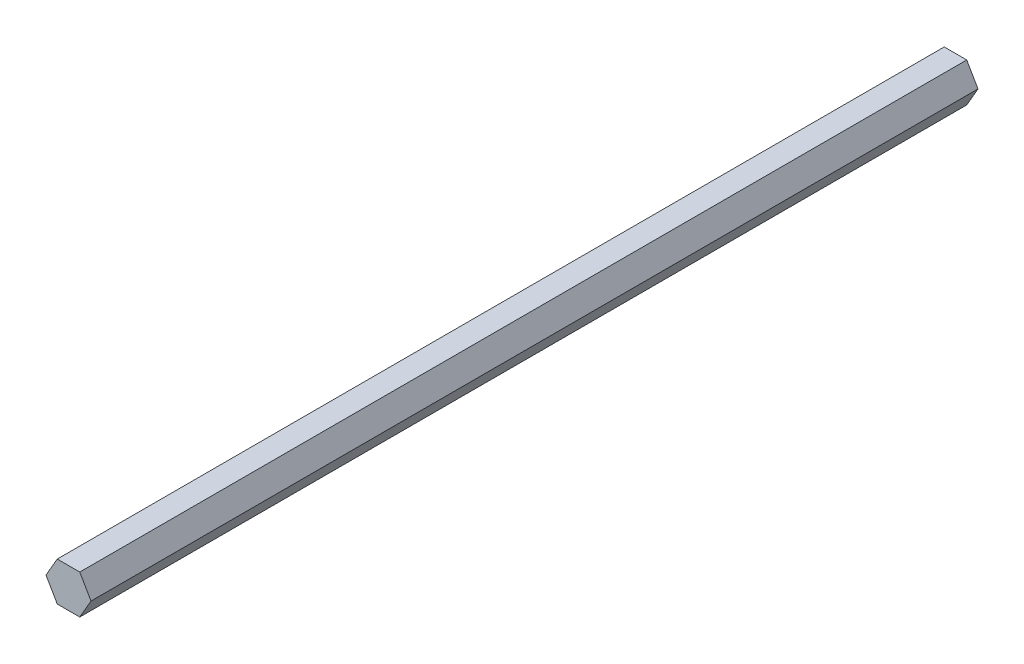
ISO-10303-21;
HEADER;
FILE_DESCRIPTION(('STEP AP214'),'2;1');
FILE_NAME('part.step','',(''),(''),'','','');
FILE_SCHEMA(('AUTOMOTIVE_DESIGN { 1 0 10303 214 1 1 1 1 }'));
ENDSEC;
DATA;
#1=APPLICATION_CONTEXT('core data for automotive mechanical design processes');
#2=APPLICATION_PROTOCOL_DEFINITION('international standard','automotive_design',2000,#1);
#3=PRODUCT_CONTEXT('',#1,'mechanical');
#4=PRODUCT('Part','Part','',(#3));
#5=PRODUCT_RELATED_PRODUCT_CATEGORY('part','',(#4));
#6=PRODUCT_DEFINITION_FORMATION('','',#4);
#7=PRODUCT_DEFINITION_CONTEXT('part definition',#1,'design');
#8=PRODUCT_DEFINITION('design','',#6,#7);
#9=PRODUCT_DEFINITION_SHAPE('','',#8);
#10=(LENGTH_UNIT() NAMED_UNIT(*) SI_UNIT(.MILLI.,.METRE.));
#11=(NAMED_UNIT(*) PLANE_ANGLE_UNIT() SI_UNIT($,.RADIAN.));
#12=(NAMED_UNIT(*) SI_UNIT($,.STERADIAN.) SOLID_ANGLE_UNIT());
#13=UNCERTAINTY_MEASURE_WITH_UNIT(LENGTH_MEASURE(1.E-05),#10,'distance_accuracy_value','');
#14=(GEOMETRIC_REPRESENTATION_CONTEXT(3) GLOBAL_UNCERTAINTY_ASSIGNED_CONTEXT((#13)) GLOBAL_UNIT_ASSIGNED_CONTEXT((#10,
#11,#12)) REPRESENTATION_CONTEXT('',''));
#15=CARTESIAN_POINT('',(0.,0.,0.));
#16=DIRECTION('',(0.,0.,1.));
#17=DIRECTION('',(1.,0.,0.));
#18=AXIS2_PLACEMENT_3D('',#15,#16,#17);
#19=CARTESIAN_POINT('',(3.6661742093542,-6.34999999999996,144.4625));
#20=DIRECTION('',(-0.866025403784442,0.499999999999995,0.));
#21=DIRECTION('',(-0.499999999999995,-0.866025403784442,0.));
#22=AXIS2_PLACEMENT_3D('',#19,#20,#21);
#23=PLANE('',#22);
#24=DIRECTION('',(0.499999999999995,0.866025403784441,0.));
#25=VECTOR('',#24,1.);
#26=CARTESIAN_POINT('',(3.6661742093542,-6.34999999999996,-144.4625));
#27=LINE('',#26,#25);
#28=CARTESIAN_POINT('',(3.6661742093542,-6.34999999999996,-144.4625));
#29=VERTEX_POINT('',#28);
#30=CARTESIAN_POINT('',(7.33234841870825,0.,-144.4625));
#31=VERTEX_POINT('',#30);
#32=EDGE_CURVE('E117',#29,#31,#27,.T.);
#33=ORIENTED_EDGE('',*,*,#32,.T.);
#34=DIRECTION('',(0.,0.,-1.));
#35=VECTOR('',#34,1.);
#36=CARTESIAN_POINT('',(7.33234841870825,0.,144.4625));
#37=LINE('',#36,#35);
#38=CARTESIAN_POINT('',(7.33234841870825,0.,144.4625));
#39=VERTEX_POINT('',#38);
#40=EDGE_CURVE('E11',#39,#31,#37,.T.);
#41=ORIENTED_EDGE('',*,*,#40,.F.);
#42=DIRECTION('',(0.499999999999995,0.866025403784441,0.));
#43=VECTOR('',#42,1.);
#44=CARTESIAN_POINT('',(3.6661742093542,-6.34999999999996,144.4625));
#45=LINE('',#44,#43);
#46=CARTESIAN_POINT('',(3.6661742093542,-6.34999999999996,144.4625));
#47=VERTEX_POINT('',#46);
#48=EDGE_CURVE('E127',#47,#39,#45,.T.);
#49=ORIENTED_EDGE('',*,*,#48,.F.);
#50=DIRECTION('',(0.,0.,-1.));
#51=VECTOR('',#50,1.);
#52=CARTESIAN_POINT('',(3.6661742093542,-6.34999999999996,144.4625));
#53=LINE('',#52,#51);
#54=EDGE_CURVE('E113',#47,#29,#53,.T.);
#55=ORIENTED_EDGE('',*,*,#54,.T.);
#56=EDGE_LOOP('',(#33,#41,#49,#55));
#57=FACE_BOUND('',#56,.T.);
#58=ADVANCED_FACE('F33',(#57),#23,.F.);
#59=CARTESIAN_POINT('',(7.33234841870825,0.,144.4625));
#60=DIRECTION('',(-0.866025403784438,-0.500000000000001,0.));
#61=DIRECTION('',(0.500000000000001,-0.866025403784438,0.));
#62=AXIS2_PLACEMENT_3D('',#59,#60,#61);
#63=PLANE('',#62);
#64=DIRECTION('',(-0.500000000000001,0.866025403784438,0.));
#65=VECTOR('',#64,1.);
#66=CARTESIAN_POINT('',(7.33234841870825,0.,-144.4625));
#67=LINE('',#66,#65);
#68=CARTESIAN_POINT('',(3.66617420935411,6.35000000000001,-144.4625));
#69=VERTEX_POINT('',#68);
#70=EDGE_CURVE('E120',#31,#69,#67,.T.);
#71=ORIENTED_EDGE('',*,*,#70,.T.);
#72=DIRECTION('',(0.,0.,-1.));
#73=VECTOR('',#72,1.);
#74=CARTESIAN_POINT('',(3.66617420935411,6.35000000000001,144.4625));
#75=LINE('',#74,#73);
#76=CARTESIAN_POINT('',(3.66617420935411,6.35000000000001,144.4625));
#77=VERTEX_POINT('',#76);
#78=EDGE_CURVE('E41',#77,#69,#75,.T.);
#79=ORIENTED_EDGE('',*,*,#78,.F.);
#80=DIRECTION('',(-0.500000000000001,0.866025403784438,0.));
#81=VECTOR('',#80,1.);
#82=CARTESIAN_POINT('',(7.33234841870825,0.,144.4625));
#83=LINE('',#82,#81);
#84=EDGE_CURVE('E86',#39,#77,#83,.T.);
#85=ORIENTED_EDGE('',*,*,#84,.F.);
#86=ORIENTED_EDGE('',*,*,#40,.T.);
#87=EDGE_LOOP('',(#71,#79,#85,#86));
#88=FACE_BOUND('',#87,.T.);
#89=ADVANCED_FACE('F151',(#88),#63,.F.);
#90=CARTESIAN_POINT('',(3.66617420935411,6.35000000000001,144.4625));
#91=DIRECTION('',(0.,-1.,0.));
#92=DIRECTION('',(1.,0.,0.));
#93=AXIS2_PLACEMENT_3D('',#90,#91,#92);
#94=PLANE('',#93);
#95=DIRECTION('',(-1.,0.,0.));
#96=VECTOR('',#95,1.);
#97=CARTESIAN_POINT('',(3.66617420935411,6.35000000000001,-144.4625));
#98=LINE('',#97,#96);
#99=CARTESIAN_POINT('',(-3.66617420935416,6.34999999999999,-144.4625));
#100=VERTEX_POINT('',#99);
#101=EDGE_CURVE('E122',#69,#100,#98,.T.);
#102=ORIENTED_EDGE('',*,*,#101,.T.);
#103=DIRECTION('',(0.,0.,-1.));
#104=VECTOR('',#103,1.);
#105=CARTESIAN_POINT('',(-3.66617420935416,6.34999999999999,144.4625));
#106=LINE('',#105,#104);
#107=CARTESIAN_POINT('',(-3.66617420935416,6.34999999999999,144.4625));
#108=VERTEX_POINT('',#107);
#109=EDGE_CURVE('E108',#108,#100,#106,.T.);
#110=ORIENTED_EDGE('',*,*,#109,.F.);
#111=DIRECTION('',(-1.,0.,0.));
#112=VECTOR('',#111,1.);
#113=CARTESIAN_POINT('',(3.66617420935411,6.35000000000001,144.4625));
#114=LINE('',#113,#112);
#115=EDGE_CURVE('E99',#77,#108,#114,.T.);
#116=ORIENTED_EDGE('',*,*,#115,.F.);
#117=ORIENTED_EDGE('',*,*,#78,.T.);
#118=EDGE_LOOP('',(#102,#110,#116,#117));
#119=FACE_BOUND('',#118,.T.);
#120=ADVANCED_FACE('F133',(#119),#94,.F.);
#121=CARTESIAN_POINT('',(-3.66617420935416,6.34999999999999,144.4625));
#122=DIRECTION('',(0.866025403784442,-0.499999999999995,0.));
#123=DIRECTION('',(0.499999999999995,0.866025403784442,0.));
#124=AXIS2_PLACEMENT_3D('',#121,#122,#123);
#125=PLANE('',#124);
#126=DIRECTION('',(-0.499999999999995,-0.866025403784441,0.));
#127=VECTOR('',#126,1.);
#128=CARTESIAN_POINT('',(-3.66617420935416,6.34999999999999,-144.4625));
#129=LINE('',#128,#127);
#130=CARTESIAN_POINT('',(-7.33234841870825,0.,-144.4625));
#131=VERTEX_POINT('',#130);
#132=EDGE_CURVE('E107',#100,#131,#129,.T.);
#133=ORIENTED_EDGE('',*,*,#132,.T.);
#134=DIRECTION('',(0.,0.,-1.));
#135=VECTOR('',#134,1.);
#136=CARTESIAN_POINT('',(-7.33234841870825,0.,144.4625));
#137=LINE('',#136,#135);
#138=CARTESIAN_POINT('',(-7.33234841870825,0.,144.4625));
#139=VERTEX_POINT('',#138);
#140=EDGE_CURVE('E104',#139,#131,#137,.T.);
#141=ORIENTED_EDGE('',*,*,#140,.F.);
#142=DIRECTION('',(-0.499999999999995,-0.866025403784441,0.));
#143=VECTOR('',#142,1.);
#144=CARTESIAN_POINT('',(-3.66617420935416,6.34999999999999,144.4625));
#145=LINE('',#144,#143);
#146=EDGE_CURVE('E93',#108,#139,#145,.T.);
#147=ORIENTED_EDGE('',*,*,#146,.F.);
#148=ORIENTED_EDGE('',*,*,#109,.T.);
#149=EDGE_LOOP('',(#133,#141,#147,#148));
#150=FACE_BOUND('',#149,.T.);
#151=ADVANCED_FACE('F105',(#150),#125,.F.);
#152=CARTESIAN_POINT('',(-7.33234841870825,0.,144.4625));
#153=DIRECTION('',(0.866025403784435,0.500000000000007,0.));
#154=DIRECTION('',(-0.500000000000007,0.866025403784435,0.));
#155=AXIS2_PLACEMENT_3D('',#152,#153,#154);
#156=PLANE('',#155);
#157=DIRECTION('',(0.500000000000007,-0.866025403784435,0.));
#158=VECTOR('',#157,1.);
#159=CARTESIAN_POINT('',(-7.33234841870825,0.,-144.4625));
#160=LINE('',#159,#158);
#161=CARTESIAN_POINT('',(-3.66617420935407,-6.35000000000004,-144.4625));
#162=VERTEX_POINT('',#161);
#163=EDGE_CURVE('E72',#131,#162,#160,.T.);
#164=ORIENTED_EDGE('',*,*,#163,.T.);
#165=DIRECTION('',(0.,0.,-1.));
#166=VECTOR('',#165,1.);
#167=CARTESIAN_POINT('',(-3.66617420935407,-6.35000000000004,144.4625));
#168=LINE('',#167,#166);
#169=CARTESIAN_POINT('',(-3.66617420935407,-6.35000000000004,144.4625));
#170=VERTEX_POINT('',#169);
#171=EDGE_CURVE('E109',#170,#162,#168,.T.);
#172=ORIENTED_EDGE('',*,*,#171,.F.);
#173=DIRECTION('',(0.500000000000007,-0.866025403784435,0.));
#174=VECTOR('',#173,1.);
#175=CARTESIAN_POINT('',(-7.33234841870825,0.,144.4625));
#176=LINE('',#175,#174);
#177=EDGE_CURVE('E97',#139,#170,#176,.T.);
#178=ORIENTED_EDGE('',*,*,#177,.F.);
#179=ORIENTED_EDGE('',*,*,#140,.T.);
#180=EDGE_LOOP('',(#164,#172,#178,#179));
#181=FACE_BOUND('',#180,.T.);
#182=ADVANCED_FACE('F111',(#181),#156,.F.);
#183=CARTESIAN_POINT('',(-3.66617420935407,-6.35000000000004,144.4625));
#184=DIRECTION('',(0.,1.,0.));
#185=DIRECTION('',(-1.,0.,0.));
#186=AXIS2_PLACEMENT_3D('',#183,#184,#185);
#187=PLANE('',#186);
#188=DIRECTION('',(1.,0.,0.));
#189=VECTOR('',#188,1.);
#190=CARTESIAN_POINT('',(-3.66617420935407,-6.35000000000004,-144.4625));
#191=LINE('',#190,#189);
#192=EDGE_CURVE('E78',#162,#29,#191,.T.);
#193=ORIENTED_EDGE('',*,*,#192,.T.);
#194=ORIENTED_EDGE('',*,*,#54,.F.);
#195=DIRECTION('',(1.,0.,0.));
#196=VECTOR('',#195,1.);
#197=CARTESIAN_POINT('',(-3.66617420935407,-6.35000000000004,144.4625));
#198=LINE('',#197,#196);
#199=EDGE_CURVE('E49',#170,#47,#198,.T.);
#200=ORIENTED_EDGE('',*,*,#199,.F.);
#201=ORIENTED_EDGE('',*,*,#171,.T.);
#202=EDGE_LOOP('',(#193,#194,#200,#201));
#203=FACE_BOUND('',#202,.T.);
#204=ADVANCED_FACE('F140',(#203),#187,.F.);
#205=CARTESIAN_POINT('',(0.,0.,144.4625));
#206=DIRECTION('',(0.,0.,1.));
#207=DIRECTION('',(1.,0.,0.));
#208=AXIS2_PLACEMENT_3D('',#205,#206,#207);
#209=PLANE('',#208);
#210=ORIENTED_EDGE('',*,*,#48,.T.);
#211=ORIENTED_EDGE('',*,*,#84,.T.);
#212=ORIENTED_EDGE('',*,*,#115,.T.);
#213=ORIENTED_EDGE('',*,*,#146,.T.);
#214=ORIENTED_EDGE('',*,*,#177,.T.);
#215=ORIENTED_EDGE('',*,*,#199,.T.);
#216=EDGE_LOOP('',(#210,#211,#212,#213,#214,#215));
#217=FACE_BOUND('',#216,.T.);
#218=ADVANCED_FACE('F95',(#217),#209,.T.);
#219=CARTESIAN_POINT('',(0.,0.,-144.4625));
#220=DIRECTION('',(0.,0.,1.));
#221=DIRECTION('',(1.,0.,0.));
#222=AXIS2_PLACEMENT_3D('',#219,#220,#221);
#223=PLANE('',#222);
#224=ORIENTED_EDGE('',*,*,#32,.F.);
#225=ORIENTED_EDGE('',*,*,#192,.F.);
#226=ORIENTED_EDGE('',*,*,#163,.F.);
#227=ORIENTED_EDGE('',*,*,#132,.F.);
#228=ORIENTED_EDGE('',*,*,#101,.F.);
#229=ORIENTED_EDGE('',*,*,#70,.F.);
#230=EDGE_LOOP('',(#224,#225,#226,#227,#228,#229));
#231=FACE_BOUND('',#230,.T.);
#232=ADVANCED_FACE('F136',(#231),#223,.F.);
#233=CLOSED_SHELL('',(#58,#89,#120,#151,#182,#204,#218,#232));
#234=MANIFOLD_SOLID_BREP('B2',#233);
#235=ADVANCED_BREP_SHAPE_REPRESENTATION('',(#18,#234),#14);
#236=SHAPE_DEFINITION_REPRESENTATION(#9,#235);
ENDSEC;
END-ISO-10303-21;
